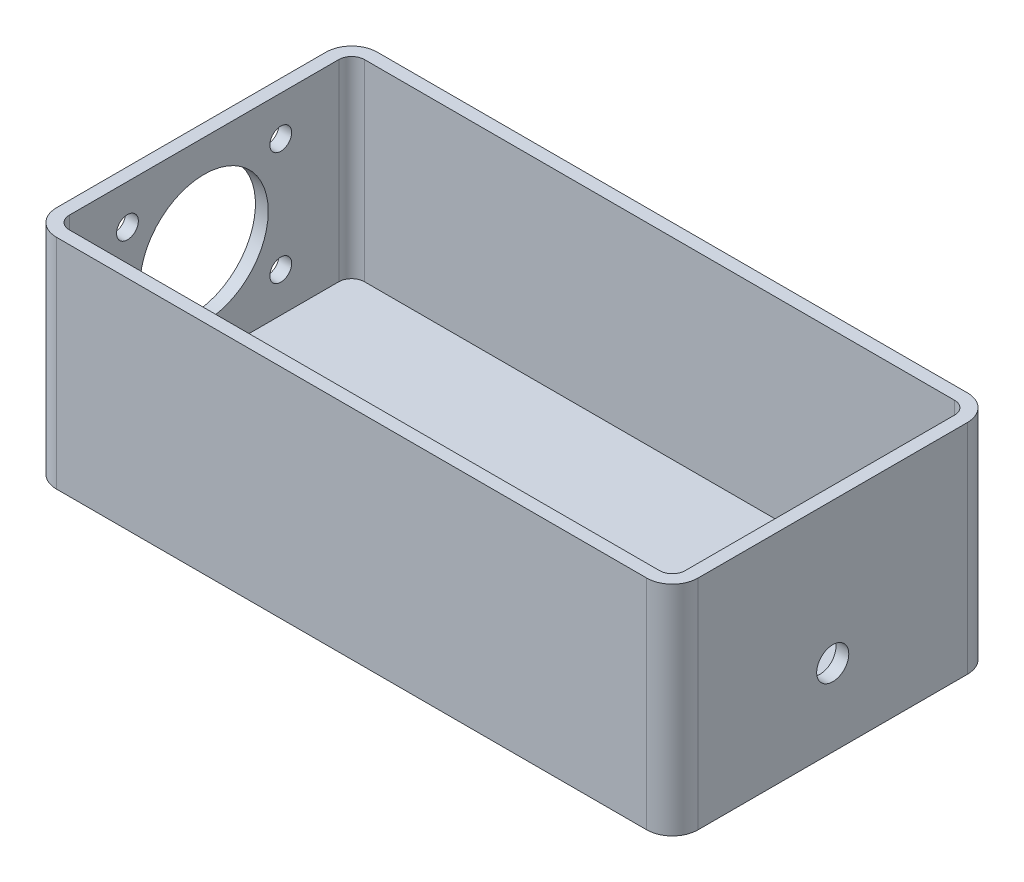
ISO-10303-21;
HEADER;
FILE_DESCRIPTION(('STEP AP214'),'2;1');
FILE_NAME('part.step','',(''),(''),'','','');
FILE_SCHEMA(('AUTOMOTIVE_DESIGN { 1 0 10303 214 1 1 1 1 }'));
ENDSEC;
DATA;
#1=APPLICATION_CONTEXT('core data for automotive mechanical design processes');
#2=APPLICATION_PROTOCOL_DEFINITION('international standard','automotive_design',2000,#1);
#3=PRODUCT_CONTEXT('',#1,'mechanical');
#4=PRODUCT('Part','Part','',(#3));
#5=PRODUCT_RELATED_PRODUCT_CATEGORY('part','',(#4));
#6=PRODUCT_DEFINITION_FORMATION('','',#4);
#7=PRODUCT_DEFINITION_CONTEXT('part definition',#1,'design');
#8=PRODUCT_DEFINITION('design','',#6,#7);
#9=PRODUCT_DEFINITION_SHAPE('','',#8);
#10=(LENGTH_UNIT() NAMED_UNIT(*) SI_UNIT(.MILLI.,.METRE.));
#11=(NAMED_UNIT(*) PLANE_ANGLE_UNIT() SI_UNIT($,.RADIAN.));
#12=(NAMED_UNIT(*) SI_UNIT($,.STERADIAN.) SOLID_ANGLE_UNIT());
#13=UNCERTAINTY_MEASURE_WITH_UNIT(LENGTH_MEASURE(1.E-05),#10,'distance_accuracy_value','');
#14=(GEOMETRIC_REPRESENTATION_CONTEXT(3) GLOBAL_UNCERTAINTY_ASSIGNED_CONTEXT((#13)) GLOBAL_UNIT_ASSIGNED_CONTEXT((#10,
#11,#12)) REPRESENTATION_CONTEXT('',''));
#15=CARTESIAN_POINT('',(0.,0.,0.));
#16=DIRECTION('',(0.,0.,1.));
#17=DIRECTION('',(1.,0.,0.));
#18=AXIS2_PLACEMENT_3D('',#15,#16,#17);
#19=CARTESIAN_POINT('',(0.,5.08,0.));
#20=DIRECTION('',(1.,0.,0.));
#21=DIRECTION('',(0.,0.,-1.));
#22=AXIS2_PLACEMENT_3D('',#19,#20,#21);
#23=PLANE('',#22);
#24=CARTESIAN_POINT('',(0.,12.9032,-16.5735));
#25=DIRECTION('',(-1.,0.,0.));
#26=DIRECTION('',(0.,0.,1.));
#27=AXIS2_PLACEMENT_3D('',#24,#25,#26);
#28=CIRCLE('',#27,2.159);
#29=CARTESIAN_POINT('',(0.,12.9032,-14.4145));
#30=VERTEX_POINT('',#29);
#31=EDGE_CURVE('E459',#30,#30,#28,.T.);
#32=ORIENTED_EDGE('',*,*,#31,.F.);
#33=EDGE_LOOP('',(#32));
#34=FACE_BOUND('',#33,.T.);
#35=CARTESIAN_POINT('',(0.,12.9032,-46.9265));
#36=DIRECTION('',(-1.,0.,0.));
#37=DIRECTION('',(0.,0.,1.));
#38=AXIS2_PLACEMENT_3D('',#35,#36,#37);
#39=CIRCLE('',#38,2.159);
#40=CARTESIAN_POINT('',(0.,12.9032,-44.7675));
#41=VERTEX_POINT('',#40);
#42=EDGE_CURVE('E467',#41,#41,#39,.T.);
#43=ORIENTED_EDGE('',*,*,#42,.F.);
#44=EDGE_LOOP('',(#43));
#45=FACE_BOUND('',#44,.T.);
#46=CARTESIAN_POINT('',(0.,35.3568,-16.5735));
#47=DIRECTION('',(-1.,0.,0.));
#48=DIRECTION('',(0.,0.,1.));
#49=AXIS2_PLACEMENT_3D('',#46,#47,#48);
#50=CIRCLE('',#49,2.159);
#51=CARTESIAN_POINT('',(0.,35.3568,-14.4145));
#52=VERTEX_POINT('',#51);
#53=EDGE_CURVE('E473',#52,#52,#50,.T.);
#54=ORIENTED_EDGE('',*,*,#53,.F.);
#55=EDGE_LOOP('',(#54));
#56=FACE_BOUND('',#55,.T.);
#57=CARTESIAN_POINT('',(0.,35.3568,-46.9265));
#58=DIRECTION('',(-1.,0.,0.));
#59=DIRECTION('',(0.,0.,1.));
#60=AXIS2_PLACEMENT_3D('',#57,#58,#59);
#61=CIRCLE('',#60,2.159);
#62=CARTESIAN_POINT('',(0.,35.3568,-44.7675));
#63=VERTEX_POINT('',#62);
#64=EDGE_CURVE('E458',#63,#63,#61,.T.);
#65=ORIENTED_EDGE('',*,*,#64,.F.);
#66=EDGE_LOOP('',(#65));
#67=FACE_BOUND('',#66,.T.);
#68=CARTESIAN_POINT('',(0.,24.13,-31.75));
#69=DIRECTION('',(-1.,0.,0.));
#70=DIRECTION('',(0.,0.,1.));
#71=AXIS2_PLACEMENT_3D('',#68,#69,#70);
#72=CIRCLE('',#71,12.7);
#73=CARTESIAN_POINT('',(0.,24.13,-19.05));
#74=VERTEX_POINT('',#73);
#75=EDGE_CURVE('E275',#74,#74,#72,.T.);
#76=ORIENTED_EDGE('',*,*,#75,.F.);
#77=EDGE_LOOP('',(#76));
#78=FACE_BOUND('',#77,.T.);
#79=DIRECTION('',(0.,0.,1.));
#80=VECTOR('',#79,1.);
#81=CARTESIAN_POINT('',(0.,43.18,-63.5));
#82=LINE('',#81,#80);
#83=CARTESIAN_POINT('',(0.,43.18,-58.42));
#84=VERTEX_POINT('',#83);
#85=CARTESIAN_POINT('',(0.,43.18,-5.08));
#86=VERTEX_POINT('',#85);
#87=EDGE_CURVE('E164',#84,#86,#82,.T.);
#88=ORIENTED_EDGE('',*,*,#87,.F.);
#89=DIRECTION('',(0.,-1.,0.));
#90=VECTOR('',#89,1.);
#91=CARTESIAN_POINT('',(0.,5.08,-58.42));
#92=LINE('',#91,#90);
#93=CARTESIAN_POINT('',(0.,0.,-58.42));
#94=VERTEX_POINT('',#93);
#95=EDGE_CURVE('E149',#84,#94,#92,.T.);
#96=ORIENTED_EDGE('',*,*,#95,.T.);
#97=DIRECTION('',(0.,0.,1.));
#98=VECTOR('',#97,1.);
#99=CARTESIAN_POINT('',(0.,0.,0.));
#100=LINE('',#99,#98);
#101=CARTESIAN_POINT('',(0.,0.,-5.08));
#102=VERTEX_POINT('',#101);
#103=EDGE_CURVE('E161',#94,#102,#100,.T.);
#104=ORIENTED_EDGE('',*,*,#103,.T.);
#105=DIRECTION('',(0.,-1.,0.));
#106=VECTOR('',#105,1.);
#107=CARTESIAN_POINT('',(0.,5.08,-5.08));
#108=LINE('',#107,#106);
#109=EDGE_CURVE('E166',#102,#86,#108,.F.);
#110=ORIENTED_EDGE('',*,*,#109,.T.);
#111=EDGE_LOOP('',(#88,#96,#104,#110));
#112=FACE_BOUND('',#111,.T.);
#113=ADVANCED_FACE('F32',(#34,#45,#56,#67,#78,#112),#23,.F.);
#114=CARTESIAN_POINT('',(0.,5.08,0.));
#115=DIRECTION('',(0.,0.,-1.));
#116=DIRECTION('',(-1.,0.,0.));
#117=AXIS2_PLACEMENT_3D('',#114,#115,#116);
#118=PLANE('',#117);
#119=DIRECTION('',(1.,0.,0.));
#120=VECTOR('',#119,1.);
#121=CARTESIAN_POINT('',(0.,0.,0.));
#122=LINE('',#121,#120);
#123=CARTESIAN_POINT('',(5.08,0.,0.));
#124=VERTEX_POINT('',#123);
#125=CARTESIAN_POINT('',(121.92,0.,0.));
#126=VERTEX_POINT('',#125);
#127=EDGE_CURVE('E170',#124,#126,#122,.T.);
#128=ORIENTED_EDGE('',*,*,#127,.T.);
#129=DIRECTION('',(0.,-1.,0.));
#130=VECTOR('',#129,1.);
#131=CARTESIAN_POINT('',(121.92,5.08,0.));
#132=LINE('',#131,#130);
#133=CARTESIAN_POINT('',(121.92,43.18,0.));
#134=VERTEX_POINT('',#133);
#135=EDGE_CURVE('E209',#126,#134,#132,.F.);
#136=ORIENTED_EDGE('',*,*,#135,.T.);
#137=DIRECTION('',(1.,0.,0.));
#138=VECTOR('',#137,1.);
#139=CARTESIAN_POINT('',(0.,43.18,0.));
#140=LINE('',#139,#138);
#141=CARTESIAN_POINT('',(5.08,43.18,0.));
#142=VERTEX_POINT('',#141);
#143=EDGE_CURVE('E281',#142,#134,#140,.T.);
#144=ORIENTED_EDGE('',*,*,#143,.F.);
#145=DIRECTION('',(0.,-1.,0.));
#146=VECTOR('',#145,1.);
#147=CARTESIAN_POINT('',(5.08,5.08,0.));
#148=LINE('',#147,#146);
#149=EDGE_CURVE('E206',#142,#124,#148,.T.);
#150=ORIENTED_EDGE('',*,*,#149,.T.);
#151=EDGE_LOOP('',(#128,#136,#144,#150));
#152=FACE_BOUND('',#151,.T.);
#153=ADVANCED_FACE('F304',(#152),#118,.F.);
#154=CARTESIAN_POINT('',(127.,5.08,0.));
#155=DIRECTION('',(-1.,0.,0.));
#156=DIRECTION('',(0.,0.,1.));
#157=AXIS2_PLACEMENT_3D('',#154,#155,#156);
#158=PLANE('',#157);
#159=CARTESIAN_POINT('',(127.,15.24,-31.75));
#160=DIRECTION('',(1.,0.,0.));
#161=DIRECTION('',(0.,0.,-1.));
#162=AXIS2_PLACEMENT_3D('',#159,#160,#161);
#163=CIRCLE('',#162,3.175);
#164=CARTESIAN_POINT('',(127.,15.24,-34.925));
#165=VERTEX_POINT('',#164);
#166=EDGE_CURVE('E466',#165,#165,#163,.T.);
#167=ORIENTED_EDGE('',*,*,#166,.F.);
#168=EDGE_LOOP('',(#167));
#169=FACE_BOUND('',#168,.T.);
#170=DIRECTION('',(0.,0.,-1.));
#171=VECTOR('',#170,1.);
#172=CARTESIAN_POINT('',(127.,0.,0.));
#173=LINE('',#172,#171);
#174=CARTESIAN_POINT('',(127.,0.,-5.08));
#175=VERTEX_POINT('',#174);
#176=CARTESIAN_POINT('',(127.,0.,-58.42));
#177=VERTEX_POINT('',#176);
#178=EDGE_CURVE('E174',#175,#177,#173,.T.);
#179=ORIENTED_EDGE('',*,*,#178,.T.);
#180=DIRECTION('',(0.,-1.,0.));
#181=VECTOR('',#180,1.);
#182=CARTESIAN_POINT('',(127.,5.08,-58.42));
#183=LINE('',#182,#181);
#184=CARTESIAN_POINT('',(127.,43.18,-58.42));
#185=VERTEX_POINT('',#184);
#186=EDGE_CURVE('E204',#177,#185,#183,.F.);
#187=ORIENTED_EDGE('',*,*,#186,.T.);
#188=DIRECTION('',(0.,0.,-1.));
#189=VECTOR('',#188,1.);
#190=CARTESIAN_POINT('',(127.,43.18,-63.5));
#191=LINE('',#190,#189);
#192=CARTESIAN_POINT('',(127.,43.18,-5.08));
#193=VERTEX_POINT('',#192);
#194=EDGE_CURVE('E177',#193,#185,#191,.T.);
#195=ORIENTED_EDGE('',*,*,#194,.F.);
#196=DIRECTION('',(0.,-1.,0.));
#197=VECTOR('',#196,1.);
#198=CARTESIAN_POINT('',(127.,5.08,-5.08));
#199=LINE('',#198,#197);
#200=EDGE_CURVE('E201',#193,#175,#199,.T.);
#201=ORIENTED_EDGE('',*,*,#200,.T.);
#202=EDGE_LOOP('',(#179,#187,#195,#201));
#203=FACE_BOUND('',#202,.T.);
#204=ADVANCED_FACE('F299',(#169,#203),#158,.F.);
#205=CARTESIAN_POINT('',(0.,5.08,-63.5));
#206=DIRECTION('',(0.,0.,1.));
#207=DIRECTION('',(1.,0.,0.));
#208=AXIS2_PLACEMENT_3D('',#205,#206,#207);
#209=PLANE('',#208);
#210=DIRECTION('',(-1.,0.,0.));
#211=VECTOR('',#210,1.);
#212=CARTESIAN_POINT('',(0.,0.,-63.5));
#213=LINE('',#212,#211);
#214=CARTESIAN_POINT('',(121.92,0.,-63.5));
#215=VERTEX_POINT('',#214);
#216=CARTESIAN_POINT('',(5.08,0.,-63.5));
#217=VERTEX_POINT('',#216);
#218=EDGE_CURVE('E183',#215,#217,#213,.T.);
#219=ORIENTED_EDGE('',*,*,#218,.T.);
#220=DIRECTION('',(0.,-1.,0.));
#221=VECTOR('',#220,1.);
#222=CARTESIAN_POINT('',(5.08,5.08,-63.5));
#223=LINE('',#222,#221);
#224=CARTESIAN_POINT('',(5.08,43.18,-63.5));
#225=VERTEX_POINT('',#224);
#226=EDGE_CURVE('E150',#217,#225,#223,.F.);
#227=ORIENTED_EDGE('',*,*,#226,.T.);
#228=DIRECTION('',(-1.,0.,0.));
#229=VECTOR('',#228,1.);
#230=CARTESIAN_POINT('',(0.,43.18,-63.5));
#231=LINE('',#230,#229);
#232=CARTESIAN_POINT('',(121.92,43.18,-63.5));
#233=VERTEX_POINT('',#232);
#234=EDGE_CURVE('E171',#233,#225,#231,.T.);
#235=ORIENTED_EDGE('',*,*,#234,.F.);
#236=DIRECTION('',(0.,-1.,0.));
#237=VECTOR('',#236,1.);
#238=CARTESIAN_POINT('',(121.92,5.08,-63.5));
#239=LINE('',#238,#237);
#240=EDGE_CURVE('E155',#233,#215,#239,.T.);
#241=ORIENTED_EDGE('',*,*,#240,.T.);
#242=EDGE_LOOP('',(#219,#227,#235,#241));
#243=FACE_BOUND('',#242,.T.);
#244=ADVANCED_FACE('F297',(#243),#209,.F.);
#245=CARTESIAN_POINT('',(0.,0.,0.));
#246=DIRECTION('',(0.,-1.,0.));
#247=DIRECTION('',(0.,0.,-1.));
#248=AXIS2_PLACEMENT_3D('',#245,#246,#247);
#249=PLANE('',#248);
#250=ORIENTED_EDGE('',*,*,#103,.F.);
#251=CARTESIAN_POINT('',(5.08,0.,-58.42));
#252=DIRECTION('',(0.,-1.,0.));
#253=DIRECTION('',(0.,0.,-1.));
#254=AXIS2_PLACEMENT_3D('',#251,#252,#253);
#255=CIRCLE('',#254,5.08);
#256=EDGE_CURVE('E145',#94,#217,#255,.T.);
#257=ORIENTED_EDGE('',*,*,#256,.T.);
#258=ORIENTED_EDGE('',*,*,#218,.F.);
#259=CARTESIAN_POINT('',(121.92,0.,-58.42));
#260=DIRECTION('',(0.,-1.,0.));
#261=DIRECTION('',(0.,0.,-1.));
#262=AXIS2_PLACEMENT_3D('',#259,#260,#261);
#263=CIRCLE('',#262,5.08);
#264=EDGE_CURVE('E156',#215,#177,#263,.T.);
#265=ORIENTED_EDGE('',*,*,#264,.T.);
#266=ORIENTED_EDGE('',*,*,#178,.F.);
#267=CARTESIAN_POINT('',(121.92,0.,-5.08));
#268=DIRECTION('',(0.,-1.,0.));
#269=DIRECTION('',(0.,0.,-1.));
#270=AXIS2_PLACEMENT_3D('',#267,#268,#269);
#271=CIRCLE('',#270,5.08);
#272=EDGE_CURVE('E187',#175,#126,#271,.T.);
#273=ORIENTED_EDGE('',*,*,#272,.T.);
#274=ORIENTED_EDGE('',*,*,#127,.F.);
#275=CARTESIAN_POINT('',(5.08,0.,-5.08));
#276=DIRECTION('',(0.,-1.,0.));
#277=DIRECTION('',(0.,0.,-1.));
#278=AXIS2_PLACEMENT_3D('',#275,#276,#277);
#279=CIRCLE('',#278,5.08);
#280=EDGE_CURVE('E165',#124,#102,#279,.T.);
#281=ORIENTED_EDGE('',*,*,#280,.T.);
#282=EDGE_LOOP('',(#250,#257,#258,#265,#266,#273,#274,#281));
#283=FACE_BOUND('',#282,.T.);
#284=ADVANCED_FACE('F168',(#283),#249,.T.);
#285=CARTESIAN_POINT('',(0.,43.18,0.));
#286=DIRECTION('',(0.,1.,0.));
#287=DIRECTION('',(0.,0.,1.));
#288=AXIS2_PLACEMENT_3D('',#285,#286,#287);
#289=PLANE('',#288);
#290=ORIENTED_EDGE('',*,*,#234,.T.);
#291=CARTESIAN_POINT('',(5.08,43.18,-58.42));
#292=DIRECTION('',(0.,1.,0.));
#293=DIRECTION('',(0.,0.,1.));
#294=AXIS2_PLACEMENT_3D('',#291,#292,#293);
#295=CIRCLE('',#294,5.08);
#296=EDGE_CURVE('E199',#225,#84,#295,.T.);
#297=ORIENTED_EDGE('',*,*,#296,.T.);
#298=ORIENTED_EDGE('',*,*,#87,.T.);
#299=CARTESIAN_POINT('',(5.08,43.18,-5.08));
#300=DIRECTION('',(0.,1.,0.));
#301=DIRECTION('',(0.,0.,1.));
#302=AXIS2_PLACEMENT_3D('',#299,#300,#301);
#303=CIRCLE('',#302,5.08);
#304=EDGE_CURVE('E193',#86,#142,#303,.T.);
#305=ORIENTED_EDGE('',*,*,#304,.T.);
#306=ORIENTED_EDGE('',*,*,#143,.T.);
#307=CARTESIAN_POINT('',(121.92,43.18,-5.08));
#308=DIRECTION('',(0.,1.,0.));
#309=DIRECTION('',(0.,0.,1.));
#310=AXIS2_PLACEMENT_3D('',#307,#308,#309);
#311=CIRCLE('',#310,5.08);
#312=EDGE_CURVE('E195',#134,#193,#311,.T.);
#313=ORIENTED_EDGE('',*,*,#312,.T.);
#314=ORIENTED_EDGE('',*,*,#194,.T.);
#315=CARTESIAN_POINT('',(121.92,43.18,-58.42));
#316=DIRECTION('',(0.,1.,0.));
#317=DIRECTION('',(0.,0.,1.));
#318=AXIS2_PLACEMENT_3D('',#315,#316,#317);
#319=CIRCLE('',#318,5.08);
#320=EDGE_CURVE('E197',#185,#233,#319,.T.);
#321=ORIENTED_EDGE('',*,*,#320,.T.);
#322=EDGE_LOOP('',(#290,#297,#298,#305,#306,#313,#314,#321));
#323=FACE_BOUND('',#322,.T.);
#324=DIRECTION('',(1.,0.,0.));
#325=VECTOR('',#324,1.);
#326=CARTESIAN_POINT('',(2.54000000000001,43.18,-2.54));
#327=LINE('',#326,#325);
#328=CARTESIAN_POINT('',(5.08000000000001,43.18,-2.54));
#329=VERTEX_POINT('',#328);
#330=CARTESIAN_POINT('',(121.92,43.18,-2.54));
#331=VERTEX_POINT('',#330);
#332=EDGE_CURVE('E249',#329,#331,#327,.T.);
#333=ORIENTED_EDGE('',*,*,#332,.F.);
#334=CARTESIAN_POINT('',(5.08000000000001,43.18,-5.08));
#335=DIRECTION('',(0.,1.,0.));
#336=DIRECTION('',(0.,0.,1.));
#337=AXIS2_PLACEMENT_3D('',#334,#335,#336);
#338=CIRCLE('',#337,2.54);
#339=CARTESIAN_POINT('',(2.54000000000001,43.18,-5.08));
#340=VERTEX_POINT('',#339);
#341=EDGE_CURVE('E240',#329,#340,#338,.F.);
#342=ORIENTED_EDGE('',*,*,#341,.T.);
#343=DIRECTION('',(0.,0.,1.));
#344=VECTOR('',#343,1.);
#345=CARTESIAN_POINT('',(2.54,43.18,-60.96));
#346=LINE('',#345,#344);
#347=CARTESIAN_POINT('',(2.54,43.18,-58.42));
#348=VERTEX_POINT('',#347);
#349=EDGE_CURVE('E246',#348,#340,#346,.T.);
#350=ORIENTED_EDGE('',*,*,#349,.F.);
#351=CARTESIAN_POINT('',(5.08,43.18,-58.42));
#352=DIRECTION('',(0.,1.,0.));
#353=DIRECTION('',(0.,0.,1.));
#354=AXIS2_PLACEMENT_3D('',#351,#352,#353);
#355=CIRCLE('',#354,2.54);
#356=CARTESIAN_POINT('',(5.08,43.18,-60.96));
#357=VERTEX_POINT('',#356);
#358=EDGE_CURVE('E238',#348,#357,#355,.F.);
#359=ORIENTED_EDGE('',*,*,#358,.T.);
#360=DIRECTION('',(-1.,0.,0.));
#361=VECTOR('',#360,1.);
#362=CARTESIAN_POINT('',(2.54,43.18,-60.96));
#363=LINE('',#362,#361);
#364=CARTESIAN_POINT('',(121.92,43.18,-60.96));
#365=VERTEX_POINT('',#364);
#366=EDGE_CURVE('E282',#365,#357,#363,.T.);
#367=ORIENTED_EDGE('',*,*,#366,.F.);
#368=CARTESIAN_POINT('',(121.92,43.18,-58.42));
#369=DIRECTION('',(0.,1.,0.));
#370=DIRECTION('',(0.,0.,1.));
#371=AXIS2_PLACEMENT_3D('',#368,#369,#370);
#372=CIRCLE('',#371,2.54);
#373=CARTESIAN_POINT('',(124.46,43.18,-58.42));
#374=VERTEX_POINT('',#373);
#375=EDGE_CURVE('E40',#365,#374,#372,.F.);
#376=ORIENTED_EDGE('',*,*,#375,.T.);
#377=DIRECTION('',(0.,0.,-1.));
#378=VECTOR('',#377,1.);
#379=CARTESIAN_POINT('',(124.46,43.18,-60.96));
#380=LINE('',#379,#378);
#381=CARTESIAN_POINT('',(124.46,43.18,-5.08));
#382=VERTEX_POINT('',#381);
#383=EDGE_CURVE('E444',#382,#374,#380,.T.);
#384=ORIENTED_EDGE('',*,*,#383,.F.);
#385=CARTESIAN_POINT('',(121.92,43.18,-5.08));
#386=DIRECTION('',(0.,1.,0.));
#387=DIRECTION('',(0.,0.,1.));
#388=AXIS2_PLACEMENT_3D('',#385,#386,#387);
#389=CIRCLE('',#388,2.54);
#390=EDGE_CURVE('E11',#382,#331,#389,.F.);
#391=ORIENTED_EDGE('',*,*,#390,.T.);
#392=EDGE_LOOP('',(#333,#342,#350,#359,#367,#376,#384,#391));
#393=FACE_BOUND('',#392,.T.);
#394=ADVANCED_FACE('F245',(#323,#393),#289,.T.);
#395=CARTESIAN_POINT('',(2.54,43.18,-60.96));
#396=DIRECTION('',(1.,0.,0.));
#397=DIRECTION('',(0.,0.,-1.));
#398=AXIS2_PLACEMENT_3D('',#395,#396,#397);
#399=PLANE('',#398);
#400=CARTESIAN_POINT('',(2.54,12.9032,-16.5735));
#401=DIRECTION('',(1.,0.,0.));
#402=DIRECTION('',(0.,0.,-1.));
#403=AXIS2_PLACEMENT_3D('',#400,#401,#402);
#404=CIRCLE('',#403,2.159);
#405=CARTESIAN_POINT('',(2.54,12.9032,-18.7325));
#406=VERTEX_POINT('',#405);
#407=EDGE_CURVE('E463',#406,#406,#404,.F.);
#408=ORIENTED_EDGE('',*,*,#407,.T.);
#409=EDGE_LOOP('',(#408));
#410=FACE_BOUND('',#409,.T.);
#411=CARTESIAN_POINT('',(2.54,12.9032,-46.9265));
#412=DIRECTION('',(1.,0.,0.));
#413=DIRECTION('',(0.,0.,-1.));
#414=AXIS2_PLACEMENT_3D('',#411,#412,#413);
#415=CIRCLE('',#414,2.159);
#416=CARTESIAN_POINT('',(2.54,12.9032,-49.0855));
#417=VERTEX_POINT('',#416);
#418=EDGE_CURVE('E462',#417,#417,#415,.F.);
#419=ORIENTED_EDGE('',*,*,#418,.T.);
#420=EDGE_LOOP('',(#419));
#421=FACE_BOUND('',#420,.T.);
#422=CARTESIAN_POINT('',(2.54,35.3568,-16.5735));
#423=DIRECTION('',(1.,0.,0.));
#424=DIRECTION('',(0.,0.,-1.));
#425=AXIS2_PLACEMENT_3D('',#422,#423,#424);
#426=CIRCLE('',#425,2.159);
#427=CARTESIAN_POINT('',(2.54,35.3568,-18.7325));
#428=VERTEX_POINT('',#427);
#429=EDGE_CURVE('E470',#428,#428,#426,.F.);
#430=ORIENTED_EDGE('',*,*,#429,.T.);
#431=EDGE_LOOP('',(#430));
#432=FACE_BOUND('',#431,.T.);
#433=CARTESIAN_POINT('',(2.54,35.3568,-46.9265));
#434=DIRECTION('',(1.,0.,0.));
#435=DIRECTION('',(0.,0.,-1.));
#436=AXIS2_PLACEMENT_3D('',#433,#434,#435);
#437=CIRCLE('',#436,2.159);
#438=CARTESIAN_POINT('',(2.54,35.3568,-49.0855));
#439=VERTEX_POINT('',#438);
#440=EDGE_CURVE('E476',#439,#439,#437,.F.);
#441=ORIENTED_EDGE('',*,*,#440,.T.);
#442=EDGE_LOOP('',(#441));
#443=FACE_BOUND('',#442,.T.);
#444=CARTESIAN_POINT('',(2.54,24.13,-31.75));
#445=DIRECTION('',(1.,0.,0.));
#446=DIRECTION('',(0.,0.,-1.));
#447=AXIS2_PLACEMENT_3D('',#444,#445,#446);
#448=CIRCLE('',#447,12.7);
#449=CARTESIAN_POINT('',(2.54,24.13,-44.45));
#450=VERTEX_POINT('',#449);
#451=EDGE_CURVE('E455',#450,#450,#448,.F.);
#452=ORIENTED_EDGE('',*,*,#451,.T.);
#453=EDGE_LOOP('',(#452));
#454=FACE_BOUND('',#453,.T.);
#455=DIRECTION('',(0.,0.,1.));
#456=VECTOR('',#455,1.);
#457=CARTESIAN_POINT('',(2.54,5.08,-60.96));
#458=LINE('',#457,#456);
#459=CARTESIAN_POINT('',(2.54,5.08,-58.42));
#460=VERTEX_POINT('',#459);
#461=CARTESIAN_POINT('',(2.54000000000001,5.08,-5.08));
#462=VERTEX_POINT('',#461);
#463=EDGE_CURVE('E267',#460,#462,#458,.T.);
#464=ORIENTED_EDGE('',*,*,#463,.F.);
#465=DIRECTION('',(0.,-1.,0.));
#466=VECTOR('',#465,1.);
#467=CARTESIAN_POINT('',(2.54,43.18,-58.42));
#468=LINE('',#467,#466);
#469=EDGE_CURVE('E227',#460,#348,#468,.F.);
#470=ORIENTED_EDGE('',*,*,#469,.T.);
#471=ORIENTED_EDGE('',*,*,#349,.T.);
#472=DIRECTION('',(0.,-1.,0.));
#473=VECTOR('',#472,1.);
#474=CARTESIAN_POINT('',(2.54000000000001,5.08,-5.08));
#475=LINE('',#474,#473);
#476=EDGE_CURVE('E224',#340,#462,#475,.T.);
#477=ORIENTED_EDGE('',*,*,#476,.T.);
#478=EDGE_LOOP('',(#464,#470,#471,#477));
#479=FACE_BOUND('',#478,.T.);
#480=ADVANCED_FACE('F255',(#410,#421,#432,#443,#454,#479),#399,.T.);
#481=CARTESIAN_POINT('',(2.54000000000001,43.18,-2.54));
#482=DIRECTION('',(0.,0.,-1.));
#483=DIRECTION('',(-1.,0.,0.));
#484=AXIS2_PLACEMENT_3D('',#481,#482,#483);
#485=PLANE('',#484);
#486=DIRECTION('',(1.,0.,0.));
#487=VECTOR('',#486,1.);
#488=CARTESIAN_POINT('',(2.54000000000001,5.08,-2.54));
#489=LINE('',#488,#487);
#490=CARTESIAN_POINT('',(5.08000000000001,5.08,-2.54));
#491=VERTEX_POINT('',#490);
#492=CARTESIAN_POINT('',(121.92,5.08,-2.54));
#493=VERTEX_POINT('',#492);
#494=EDGE_CURVE('E266',#491,#493,#489,.T.);
#495=ORIENTED_EDGE('',*,*,#494,.F.);
#496=DIRECTION('',(0.,-1.,0.));
#497=VECTOR('',#496,1.);
#498=CARTESIAN_POINT('',(5.08000000000001,43.18,-2.54));
#499=LINE('',#498,#497);
#500=EDGE_CURVE('E232',#491,#329,#499,.F.);
#501=ORIENTED_EDGE('',*,*,#500,.T.);
#502=ORIENTED_EDGE('',*,*,#332,.T.);
#503=DIRECTION('',(0.,-1.,0.));
#504=VECTOR('',#503,1.);
#505=CARTESIAN_POINT('',(121.92,5.08,-2.54));
#506=LINE('',#505,#504);
#507=EDGE_CURVE('E229',#331,#493,#506,.T.);
#508=ORIENTED_EDGE('',*,*,#507,.T.);
#509=EDGE_LOOP('',(#495,#501,#502,#508));
#510=FACE_BOUND('',#509,.T.);
#511=ADVANCED_FACE('F269',(#510),#485,.T.);
#512=CARTESIAN_POINT('',(124.46,43.18,-60.96));
#513=DIRECTION('',(-1.,0.,0.));
#514=DIRECTION('',(0.,0.,1.));
#515=AXIS2_PLACEMENT_3D('',#512,#513,#514);
#516=PLANE('',#515);
#517=CARTESIAN_POINT('',(124.46,15.24,-31.75));
#518=DIRECTION('',(-1.,0.,0.));
#519=DIRECTION('',(0.,0.,1.));
#520=AXIS2_PLACEMENT_3D('',#517,#518,#519);
#521=CIRCLE('',#520,3.175);
#522=CARTESIAN_POINT('',(124.46,15.24,-28.575));
#523=VERTEX_POINT('',#522);
#524=EDGE_CURVE('E483',#523,#523,#521,.F.);
#525=ORIENTED_EDGE('',*,*,#524,.T.);
#526=EDGE_LOOP('',(#525));
#527=FACE_BOUND('',#526,.T.);
#528=ORIENTED_EDGE('',*,*,#383,.T.);
#529=DIRECTION('',(0.,-1.,0.));
#530=VECTOR('',#529,1.);
#531=CARTESIAN_POINT('',(124.46,5.08,-58.42));
#532=LINE('',#531,#530);
#533=CARTESIAN_POINT('',(124.46,5.08,-58.42));
#534=VERTEX_POINT('',#533);
#535=EDGE_CURVE('E235',#374,#534,#532,.T.);
#536=ORIENTED_EDGE('',*,*,#535,.T.);
#537=DIRECTION('',(0.,0.,-1.));
#538=VECTOR('',#537,1.);
#539=CARTESIAN_POINT('',(124.46,5.08,-60.96));
#540=LINE('',#539,#538);
#541=CARTESIAN_POINT('',(124.46,5.08,-5.08));
#542=VERTEX_POINT('',#541);
#543=EDGE_CURVE('E271',#542,#534,#540,.T.);
#544=ORIENTED_EDGE('',*,*,#543,.F.);
#545=DIRECTION('',(0.,-1.,0.));
#546=VECTOR('',#545,1.);
#547=CARTESIAN_POINT('',(124.46,43.18,-5.08));
#548=LINE('',#547,#546);
#549=EDGE_CURVE('E53',#542,#382,#548,.F.);
#550=ORIENTED_EDGE('',*,*,#549,.T.);
#551=EDGE_LOOP('',(#528,#536,#544,#550));
#552=FACE_BOUND('',#551,.T.);
#553=ADVANCED_FACE('F377',(#527,#552),#516,.T.);
#554=CARTESIAN_POINT('',(2.54,43.18,-60.96));
#555=DIRECTION('',(0.,0.,1.));
#556=DIRECTION('',(1.,0.,0.));
#557=AXIS2_PLACEMENT_3D('',#554,#555,#556);
#558=PLANE('',#557);
#559=ORIENTED_EDGE('',*,*,#366,.T.);
#560=DIRECTION('',(0.,-1.,0.));
#561=VECTOR('',#560,1.);
#562=CARTESIAN_POINT('',(5.08,5.08,-60.96));
#563=LINE('',#562,#561);
#564=CARTESIAN_POINT('',(5.08,5.08,-60.96));
#565=VERTEX_POINT('',#564);
#566=EDGE_CURVE('E213',#357,#565,#563,.T.);
#567=ORIENTED_EDGE('',*,*,#566,.T.);
#568=DIRECTION('',(-1.,0.,0.));
#569=VECTOR('',#568,1.);
#570=CARTESIAN_POINT('',(2.54,5.08,-60.96));
#571=LINE('',#570,#569);
#572=CARTESIAN_POINT('',(121.92,5.08,-60.96));
#573=VERTEX_POINT('',#572);
#574=EDGE_CURVE('E258',#573,#565,#571,.T.);
#575=ORIENTED_EDGE('',*,*,#574,.F.);
#576=DIRECTION('',(0.,-1.,0.));
#577=VECTOR('',#576,1.);
#578=CARTESIAN_POINT('',(121.92,43.18,-60.96));
#579=LINE('',#578,#577);
#580=EDGE_CURVE('E211',#573,#365,#579,.F.);
#581=ORIENTED_EDGE('',*,*,#580,.T.);
#582=EDGE_LOOP('',(#559,#567,#575,#581));
#583=FACE_BOUND('',#582,.T.);
#584=ADVANCED_FACE('F386',(#583),#558,.T.);
#585=CARTESIAN_POINT('',(0.,5.08,0.));
#586=DIRECTION('',(0.,-1.,0.));
#587=DIRECTION('',(0.,0.,-1.));
#588=AXIS2_PLACEMENT_3D('',#585,#586,#587);
#589=PLANE('',#588);
#590=ORIENTED_EDGE('',*,*,#574,.T.);
#591=CARTESIAN_POINT('',(5.08,5.08,-58.42));
#592=DIRECTION('',(0.,-1.,0.));
#593=DIRECTION('',(0.,0.,-1.));
#594=AXIS2_PLACEMENT_3D('',#591,#592,#593);
#595=CIRCLE('',#594,2.54);
#596=EDGE_CURVE('E222',#565,#460,#595,.F.);
#597=ORIENTED_EDGE('',*,*,#596,.T.);
#598=ORIENTED_EDGE('',*,*,#463,.T.);
#599=CARTESIAN_POINT('',(5.08000000000001,5.08,-5.08));
#600=DIRECTION('',(0.,-1.,0.));
#601=DIRECTION('',(0.,0.,-1.));
#602=AXIS2_PLACEMENT_3D('',#599,#600,#601);
#603=CIRCLE('',#602,2.54);
#604=EDGE_CURVE('E220',#462,#491,#603,.F.);
#605=ORIENTED_EDGE('',*,*,#604,.T.);
#606=ORIENTED_EDGE('',*,*,#494,.T.);
#607=CARTESIAN_POINT('',(121.92,5.08,-5.08));
#608=DIRECTION('',(0.,-1.,0.));
#609=DIRECTION('',(0.,0.,-1.));
#610=AXIS2_PLACEMENT_3D('',#607,#608,#609);
#611=CIRCLE('',#610,2.54);
#612=EDGE_CURVE('E216',#493,#542,#611,.F.);
#613=ORIENTED_EDGE('',*,*,#612,.T.);
#614=ORIENTED_EDGE('',*,*,#543,.T.);
#615=CARTESIAN_POINT('',(121.92,5.08,-58.42));
#616=DIRECTION('',(0.,-1.,0.));
#617=DIRECTION('',(0.,0.,-1.));
#618=AXIS2_PLACEMENT_3D('',#615,#616,#617);
#619=CIRCLE('',#618,2.54);
#620=EDGE_CURVE('E218',#534,#573,#619,.F.);
#621=ORIENTED_EDGE('',*,*,#620,.T.);
#622=EDGE_LOOP('',(#590,#597,#598,#605,#606,#613,#614,#621));
#623=FACE_BOUND('',#622,.T.);
#624=ADVANCED_FACE('F265',(#623),#589,.F.);
#625=CARTESIAN_POINT('',(127.001,24.13,-31.75));
#626=DIRECTION('',(-1.,0.,0.));
#627=DIRECTION('',(0.,0.,1.));
#628=AXIS2_PLACEMENT_3D('',#625,#626,#627);
#629=CYLINDRICAL_SURFACE('',#628,12.7);
#630=ORIENTED_EDGE('',*,*,#451,.F.);
#631=EDGE_LOOP('',(#630));
#632=FACE_BOUND('',#631,.T.);
#633=ORIENTED_EDGE('',*,*,#75,.T.);
#634=EDGE_LOOP('',(#633));
#635=FACE_BOUND('',#634,.T.);
#636=ADVANCED_FACE('F406',(#632,#635),#629,.F.);
#637=CARTESIAN_POINT('',(127.001,35.3568,-46.9265));
#638=DIRECTION('',(-1.,0.,0.));
#639=DIRECTION('',(0.,0.,1.));
#640=AXIS2_PLACEMENT_3D('',#637,#638,#639);
#641=CYLINDRICAL_SURFACE('',#640,2.159);
#642=ORIENTED_EDGE('',*,*,#440,.F.);
#643=EDGE_LOOP('',(#642));
#644=FACE_BOUND('',#643,.T.);
#645=ORIENTED_EDGE('',*,*,#64,.T.);
#646=EDGE_LOOP('',(#645));
#647=FACE_BOUND('',#646,.T.);
#648=ADVANCED_FACE('F498',(#644,#647),#641,.F.);
#649=CARTESIAN_POINT('',(127.001,35.3568,-16.5735));
#650=DIRECTION('',(-1.,0.,0.));
#651=DIRECTION('',(0.,0.,1.));
#652=AXIS2_PLACEMENT_3D('',#649,#650,#651);
#653=CYLINDRICAL_SURFACE('',#652,2.159);
#654=ORIENTED_EDGE('',*,*,#429,.F.);
#655=EDGE_LOOP('',(#654));
#656=FACE_BOUND('',#655,.T.);
#657=ORIENTED_EDGE('',*,*,#53,.T.);
#658=EDGE_LOOP('',(#657));
#659=FACE_BOUND('',#658,.T.);
#660=ADVANCED_FACE('F507',(#656,#659),#653,.F.);
#661=CARTESIAN_POINT('',(127.001,12.9032,-46.9265));
#662=DIRECTION('',(-1.,0.,0.));
#663=DIRECTION('',(0.,0.,1.));
#664=AXIS2_PLACEMENT_3D('',#661,#662,#663);
#665=CYLINDRICAL_SURFACE('',#664,2.159);
#666=ORIENTED_EDGE('',*,*,#418,.F.);
#667=EDGE_LOOP('',(#666));
#668=FACE_BOUND('',#667,.T.);
#669=ORIENTED_EDGE('',*,*,#42,.T.);
#670=EDGE_LOOP('',(#669));
#671=FACE_BOUND('',#670,.T.);
#672=ADVANCED_FACE('F503',(#668,#671),#665,.F.);
#673=CARTESIAN_POINT('',(127.001,12.9032,-16.5735));
#674=DIRECTION('',(-1.,0.,0.));
#675=DIRECTION('',(0.,0.,1.));
#676=AXIS2_PLACEMENT_3D('',#673,#674,#675);
#677=CYLINDRICAL_SURFACE('',#676,2.159);
#678=ORIENTED_EDGE('',*,*,#407,.F.);
#679=EDGE_LOOP('',(#678));
#680=FACE_BOUND('',#679,.T.);
#681=ORIENTED_EDGE('',*,*,#31,.T.);
#682=EDGE_LOOP('',(#681));
#683=FACE_BOUND('',#682,.T.);
#684=ADVANCED_FACE('F500',(#680,#683),#677,.F.);
#685=CARTESIAN_POINT('',(-0.001000000000001,15.24,-31.75));
#686=DIRECTION('',(1.,0.,0.));
#687=DIRECTION('',(0.,0.,-1.));
#688=AXIS2_PLACEMENT_3D('',#685,#686,#687);
#689=CYLINDRICAL_SURFACE('',#688,3.175);
#690=ORIENTED_EDGE('',*,*,#524,.F.);
#691=EDGE_LOOP('',(#690));
#692=FACE_BOUND('',#691,.T.);
#693=ORIENTED_EDGE('',*,*,#166,.T.);
#694=EDGE_LOOP('',(#693));
#695=FACE_BOUND('',#694,.T.);
#696=ADVANCED_FACE('F333',(#692,#695),#689,.F.);
#697=CARTESIAN_POINT('',(5.08,5.08,-58.42));
#698=DIRECTION('',(0.,-1.,0.));
#699=DIRECTION('',(0.,0.,-1.));
#700=AXIS2_PLACEMENT_3D('',#697,#698,#699);
#701=CYLINDRICAL_SURFACE('',#700,5.08);
#702=ORIENTED_EDGE('',*,*,#296,.F.);
#703=ORIENTED_EDGE('',*,*,#226,.F.);
#704=ORIENTED_EDGE('',*,*,#256,.F.);
#705=ORIENTED_EDGE('',*,*,#95,.F.);
#706=EDGE_LOOP('',(#702,#703,#704,#705));
#707=FACE_BOUND('',#706,.T.);
#708=ADVANCED_FACE('F148',(#707),#701,.T.);
#709=CARTESIAN_POINT('',(121.92,5.08,-58.42));
#710=DIRECTION('',(0.,-1.,0.));
#711=DIRECTION('',(0.,0.,-1.));
#712=AXIS2_PLACEMENT_3D('',#709,#710,#711);
#713=CYLINDRICAL_SURFACE('',#712,5.08);
#714=ORIENTED_EDGE('',*,*,#320,.F.);
#715=ORIENTED_EDGE('',*,*,#186,.F.);
#716=ORIENTED_EDGE('',*,*,#264,.F.);
#717=ORIENTED_EDGE('',*,*,#240,.F.);
#718=EDGE_LOOP('',(#714,#715,#716,#717));
#719=FACE_BOUND('',#718,.T.);
#720=ADVANCED_FACE('F295',(#719),#713,.T.);
#721=CARTESIAN_POINT('',(121.92,5.08,-5.08));
#722=DIRECTION('',(0.,-1.,0.));
#723=DIRECTION('',(0.,0.,-1.));
#724=AXIS2_PLACEMENT_3D('',#721,#722,#723);
#725=CYLINDRICAL_SURFACE('',#724,5.08);
#726=ORIENTED_EDGE('',*,*,#312,.F.);
#727=ORIENTED_EDGE('',*,*,#135,.F.);
#728=ORIENTED_EDGE('',*,*,#272,.F.);
#729=ORIENTED_EDGE('',*,*,#200,.F.);
#730=EDGE_LOOP('',(#726,#727,#728,#729));
#731=FACE_BOUND('',#730,.T.);
#732=ADVANCED_FACE('F301',(#731),#725,.T.);
#733=CARTESIAN_POINT('',(5.08,5.08,-5.08));
#734=DIRECTION('',(0.,-1.,0.));
#735=DIRECTION('',(0.,0.,-1.));
#736=AXIS2_PLACEMENT_3D('',#733,#734,#735);
#737=CYLINDRICAL_SURFACE('',#736,5.08);
#738=ORIENTED_EDGE('',*,*,#304,.F.);
#739=ORIENTED_EDGE('',*,*,#109,.F.);
#740=ORIENTED_EDGE('',*,*,#280,.F.);
#741=ORIENTED_EDGE('',*,*,#149,.F.);
#742=EDGE_LOOP('',(#738,#739,#740,#741));
#743=FACE_BOUND('',#742,.T.);
#744=ADVANCED_FACE('F309',(#743),#737,.T.);
#745=CARTESIAN_POINT('',(5.08,43.18,-58.42));
#746=DIRECTION('',(0.,1.,0.));
#747=DIRECTION('',(0.,0.,1.));
#748=AXIS2_PLACEMENT_3D('',#745,#746,#747);
#749=CYLINDRICAL_SURFACE('',#748,2.54);
#750=ORIENTED_EDGE('',*,*,#358,.F.);
#751=ORIENTED_EDGE('',*,*,#469,.F.);
#752=ORIENTED_EDGE('',*,*,#596,.F.);
#753=ORIENTED_EDGE('',*,*,#566,.F.);
#754=EDGE_LOOP('',(#750,#751,#752,#753));
#755=FACE_BOUND('',#754,.T.);
#756=ADVANCED_FACE('F311',(#755),#749,.F.);
#757=CARTESIAN_POINT('',(5.08000000000001,43.18,-5.08));
#758=DIRECTION('',(0.,1.,0.));
#759=DIRECTION('',(0.,0.,1.));
#760=AXIS2_PLACEMENT_3D('',#757,#758,#759);
#761=CYLINDRICAL_SURFACE('',#760,2.54);
#762=ORIENTED_EDGE('',*,*,#341,.F.);
#763=ORIENTED_EDGE('',*,*,#500,.F.);
#764=ORIENTED_EDGE('',*,*,#604,.F.);
#765=ORIENTED_EDGE('',*,*,#476,.F.);
#766=EDGE_LOOP('',(#762,#763,#764,#765));
#767=FACE_BOUND('',#766,.T.);
#768=ADVANCED_FACE('F260',(#767),#761,.F.);
#769=CARTESIAN_POINT('',(121.92,43.18,-58.42));
#770=DIRECTION('',(0.,1.,0.));
#771=DIRECTION('',(0.,0.,1.));
#772=AXIS2_PLACEMENT_3D('',#769,#770,#771);
#773=CYLINDRICAL_SURFACE('',#772,2.54);
#774=ORIENTED_EDGE('',*,*,#375,.F.);
#775=ORIENTED_EDGE('',*,*,#580,.F.);
#776=ORIENTED_EDGE('',*,*,#620,.F.);
#777=ORIENTED_EDGE('',*,*,#535,.F.);
#778=EDGE_LOOP('',(#774,#775,#776,#777));
#779=FACE_BOUND('',#778,.T.);
#780=ADVANCED_FACE('F423',(#779),#773,.F.);
#781=CARTESIAN_POINT('',(121.92,43.18,-5.08));
#782=DIRECTION('',(0.,1.,0.));
#783=DIRECTION('',(0.,0.,1.));
#784=AXIS2_PLACEMENT_3D('',#781,#782,#783);
#785=CYLINDRICAL_SURFACE('',#784,2.54);
#786=ORIENTED_EDGE('',*,*,#390,.F.);
#787=ORIENTED_EDGE('',*,*,#549,.F.);
#788=ORIENTED_EDGE('',*,*,#612,.F.);
#789=ORIENTED_EDGE('',*,*,#507,.F.);
#790=EDGE_LOOP('',(#786,#787,#788,#789));
#791=FACE_BOUND('',#790,.T.);
#792=ADVANCED_FACE('F34',(#791),#785,.F.);
#793=CLOSED_SHELL('',(#113,#153,#204,#244,#284,#394,#480,#511,#553,#584,#624,#636,#648,#660,
#672,#684,#696,#708,#720,#732,#744,#756,#768,#780,#792));
#794=MANIFOLD_SOLID_BREP('B2',#793);
#795=ADVANCED_BREP_SHAPE_REPRESENTATION('',(#18,#794),#14);
#796=SHAPE_DEFINITION_REPRESENTATION(#9,#795);
ENDSEC;
END-ISO-10303-21;
